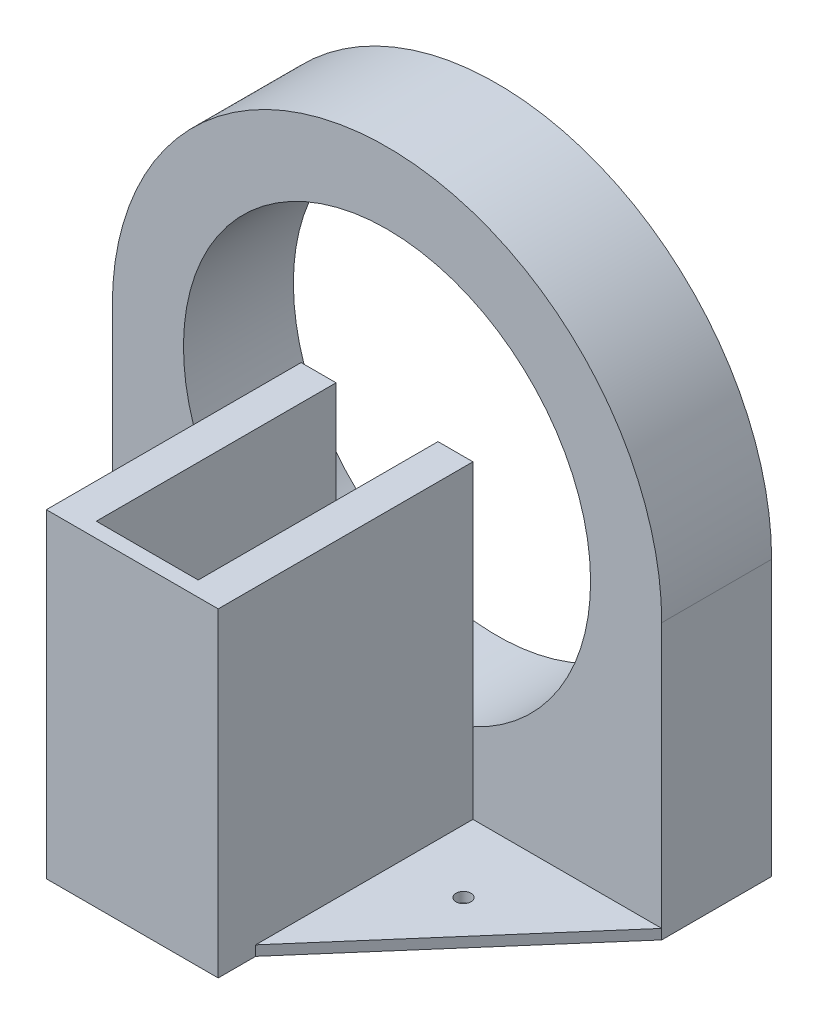
ISO-10303-21;
HEADER;
FILE_DESCRIPTION(('STEP AP214'),'2;1');
FILE_NAME('part.step','',(''),(''),'','','');
FILE_SCHEMA(('AUTOMOTIVE_DESIGN { 1 0 10303 214 1 1 1 1 }'));
ENDSEC;
DATA;
#1=APPLICATION_CONTEXT('core data for automotive mechanical design processes');
#2=APPLICATION_PROTOCOL_DEFINITION('international standard','automotive_design',2000,#1);
#3=PRODUCT_CONTEXT('',#1,'mechanical');
#4=PRODUCT('Part','Part','',(#3));
#5=PRODUCT_RELATED_PRODUCT_CATEGORY('part','',(#4));
#6=PRODUCT_DEFINITION_FORMATION('','',#4);
#7=PRODUCT_DEFINITION_CONTEXT('part definition',#1,'design');
#8=PRODUCT_DEFINITION('design','',#6,#7);
#9=PRODUCT_DEFINITION_SHAPE('','',#8);
#10=(LENGTH_UNIT() NAMED_UNIT(*) SI_UNIT(.MILLI.,.METRE.));
#11=(NAMED_UNIT(*) PLANE_ANGLE_UNIT() SI_UNIT($,.RADIAN.));
#12=(NAMED_UNIT(*) SI_UNIT($,.STERADIAN.) SOLID_ANGLE_UNIT());
#13=UNCERTAINTY_MEASURE_WITH_UNIT(LENGTH_MEASURE(1.E-05),#10,'distance_accuracy_value','');
#14=(GEOMETRIC_REPRESENTATION_CONTEXT(3) GLOBAL_UNCERTAINTY_ASSIGNED_CONTEXT((#13)) GLOBAL_UNIT_ASSIGNED_CONTEXT((#10,
#11,#12)) REPRESENTATION_CONTEXT('',''));
#15=CARTESIAN_POINT('',(0.,0.,0.));
#16=DIRECTION('',(0.,0.,1.));
#17=DIRECTION('',(1.,0.,0.));
#18=AXIS2_PLACEMENT_3D('',#15,#16,#17);
#19=CARTESIAN_POINT('',(10.2,0.,135.159204509821));
#20=DIRECTION('',(-1.,0.,0.));
#21=DIRECTION('',(0.,0.,1.));
#22=AXIS2_PLACEMENT_3D('',#19,#20,#21);
#23=PLANE('',#22);
#24=DIRECTION('',(0.,0.,-1.));
#25=VECTOR('',#24,1.);
#26=CARTESIAN_POINT('',(10.2,-31.2,135.159204509821));
#27=LINE('',#26,#25);
#28=CARTESIAN_POINT('',(10.2,-31.2,70.));
#29=VERTEX_POINT('',#28);
#30=CARTESIAN_POINT('',(10.2,-31.2,46.7));
#31=VERTEX_POINT('',#30);
#32=EDGE_CURVE('E288',#29,#31,#27,.T.);
#33=ORIENTED_EDGE('',*,*,#32,.F.);
#34=DIRECTION('',(0.,1.,0.));
#35=VECTOR('',#34,1.);
#36=CARTESIAN_POINT('',(10.2,-90.2080956599473,70.));
#37=LINE('',#36,#35);
#38=CARTESIAN_POINT('',(10.2,9.00000000000002,70.));
#39=VERTEX_POINT('',#38);
#40=EDGE_CURVE('E290',#29,#39,#37,.T.);
#41=ORIENTED_EDGE('',*,*,#40,.T.);
#42=DIRECTION('',(0.,0.,-1.));
#43=VECTOR('',#42,1.);
#44=CARTESIAN_POINT('',(10.2,9.00000000000002,135.159204509821));
#45=LINE('',#44,#43);
#46=CARTESIAN_POINT('',(10.2,9.00000000000002,22.));
#47=VERTEX_POINT('',#46);
#48=EDGE_CURVE('E296',#39,#47,#45,.T.);
#49=ORIENTED_EDGE('',*,*,#48,.T.);
#50=DIRECTION('',(0.,1.,0.));
#51=VECTOR('',#50,1.);
#52=CARTESIAN_POINT('',(10.2,0.,22.));
#53=LINE('',#52,#51);
#54=CARTESIAN_POINT('',(10.2,-31.2,22.));
#55=VERTEX_POINT('',#54);
#56=EDGE_CURVE('E452',#55,#47,#53,.T.);
#57=ORIENTED_EDGE('',*,*,#56,.F.);
#58=CARTESIAN_POINT('',(10.2,-31.2,37.7));
#59=VERTEX_POINT('',#58);
#60=EDGE_CURVE('E297',#59,#55,#27,.T.);
#61=ORIENTED_EDGE('',*,*,#60,.F.);
#62=DIRECTION('',(0.,1.,0.));
#63=VECTOR('',#62,1.);
#64=CARTESIAN_POINT('',(10.2,-37.7,37.7));
#65=LINE('',#64,#63);
#66=CARTESIAN_POINT('',(10.2,-37.7,37.7));
#67=VERTEX_POINT('',#66);
#68=EDGE_CURVE('E391',#67,#59,#65,.T.);
#69=ORIENTED_EDGE('',*,*,#68,.F.);
#70=DIRECTION('',(0.,0.,-1.));
#71=VECTOR('',#70,1.);
#72=CARTESIAN_POINT('',(10.2,-37.7,46.7));
#73=LINE('',#72,#71);
#74=CARTESIAN_POINT('',(10.2,-37.7,46.7));
#75=VERTEX_POINT('',#74);
#76=EDGE_CURVE('E371',#75,#67,#73,.T.);
#77=ORIENTED_EDGE('',*,*,#76,.F.);
#78=DIRECTION('',(0.,1.,0.));
#79=VECTOR('',#78,1.);
#80=CARTESIAN_POINT('',(10.2,-37.7,46.7));
#81=LINE('',#80,#79);
#82=EDGE_CURVE('E293',#75,#31,#81,.T.);
#83=ORIENTED_EDGE('',*,*,#82,.T.);
#84=EDGE_LOOP('',(#33,#41,#49,#57,#61,#69,#77,#83));
#85=FACE_BOUND('',#84,.T.);
#86=ADVANCED_FACE('F117',(#85),#23,.T.);
#87=CARTESIAN_POINT('',(-10.2,0.,135.159204509821));
#88=DIRECTION('',(-1.,0.,0.));
#89=DIRECTION('',(0.,0.,1.));
#90=AXIS2_PLACEMENT_3D('',#87,#88,#89);
#91=PLANE('',#90);
#92=DIRECTION('',(0.,1.,0.));
#93=VECTOR('',#92,1.);
#94=CARTESIAN_POINT('',(-10.2,-90.2080956599473,70.));
#95=LINE('',#94,#93);
#96=CARTESIAN_POINT('',(-10.2,-31.2,70.));
#97=VERTEX_POINT('',#96);
#98=CARTESIAN_POINT('',(-10.2,9.00000000000002,70.));
#99=VERTEX_POINT('',#98);
#100=EDGE_CURVE('E307',#97,#99,#95,.T.);
#101=ORIENTED_EDGE('',*,*,#100,.F.);
#102=DIRECTION('',(0.,0.,-1.));
#103=VECTOR('',#102,1.);
#104=CARTESIAN_POINT('',(-10.2,-31.2,135.159204509821));
#105=LINE('',#104,#103);
#106=CARTESIAN_POINT('',(-10.2,-31.2,46.7));
#107=VERTEX_POINT('',#106);
#108=EDGE_CURVE('E132',#97,#107,#105,.T.);
#109=ORIENTED_EDGE('',*,*,#108,.T.);
#110=DIRECTION('',(0.,1.,0.));
#111=VECTOR('',#110,1.);
#112=CARTESIAN_POINT('',(-10.2,-37.7,46.7));
#113=LINE('',#112,#111);
#114=CARTESIAN_POINT('',(-10.2,-37.7,46.7));
#115=VERTEX_POINT('',#114);
#116=EDGE_CURVE('E380',#115,#107,#113,.T.);
#117=ORIENTED_EDGE('',*,*,#116,.F.);
#118=DIRECTION('',(0.,0.,1.));
#119=VECTOR('',#118,1.);
#120=CARTESIAN_POINT('',(-10.2,-37.7,37.7));
#121=LINE('',#120,#119);
#122=CARTESIAN_POINT('',(-10.2,-37.7,37.7));
#123=VERTEX_POINT('',#122);
#124=EDGE_CURVE('E362',#123,#115,#121,.T.);
#125=ORIENTED_EDGE('',*,*,#124,.F.);
#126=DIRECTION('',(0.,1.,0.));
#127=VECTOR('',#126,1.);
#128=CARTESIAN_POINT('',(-10.2,-37.7,37.7));
#129=LINE('',#128,#127);
#130=CARTESIAN_POINT('',(-10.2,-31.2,37.7));
#131=VERTEX_POINT('',#130);
#132=EDGE_CURVE('E386',#123,#131,#129,.T.);
#133=ORIENTED_EDGE('',*,*,#132,.T.);
#134=CARTESIAN_POINT('',(-10.2,-31.2,22.));
#135=VERTEX_POINT('',#134);
#136=EDGE_CURVE('E467',#131,#135,#105,.T.);
#137=ORIENTED_EDGE('',*,*,#136,.T.);
#138=DIRECTION('',(0.,1.,0.));
#139=VECTOR('',#138,1.);
#140=CARTESIAN_POINT('',(-10.2,0.,22.));
#141=LINE('',#140,#139);
#142=CARTESIAN_POINT('',(-10.2,9.00000000000002,22.));
#143=VERTEX_POINT('',#142);
#144=EDGE_CURVE('E447',#135,#143,#141,.T.);
#145=ORIENTED_EDGE('',*,*,#144,.T.);
#146=DIRECTION('',(0.,0.,-1.));
#147=VECTOR('',#146,1.);
#148=CARTESIAN_POINT('',(-10.2,9.00000000000002,135.159204509821));
#149=LINE('',#148,#147);
#150=EDGE_CURVE('E456',#99,#143,#149,.T.);
#151=ORIENTED_EDGE('',*,*,#150,.F.);
#152=EDGE_LOOP('',(#101,#109,#117,#125,#133,#137,#145,#151));
#153=FACE_BOUND('',#152,.T.);
#154=ADVANCED_FACE('F531',(#153),#91,.F.);
#155=CARTESIAN_POINT('',(0.,-90.2080956599473,70.));
#156=DIRECTION('',(0.,0.,1.));
#157=DIRECTION('',(1.,0.,0.));
#158=AXIS2_PLACEMENT_3D('',#155,#156,#157);
#159=PLANE('',#158);
#160=DIRECTION('',(1.,0.,0.));
#161=VECTOR('',#160,1.);
#162=CARTESIAN_POINT('',(0.,-31.2,70.));
#163=LINE('',#162,#161);
#164=EDGE_CURVE('E302',#97,#29,#163,.T.);
#165=ORIENTED_EDGE('',*,*,#164,.F.);
#166=ORIENTED_EDGE('',*,*,#100,.T.);
#167=DIRECTION('',(1.,0.,0.));
#168=VECTOR('',#167,1.);
#169=CARTESIAN_POINT('',(0.,9.00000000000002,70.));
#170=LINE('',#169,#168);
#171=EDGE_CURVE('E305',#99,#39,#170,.T.);
#172=ORIENTED_EDGE('',*,*,#171,.T.);
#173=ORIENTED_EDGE('',*,*,#40,.F.);
#174=EDGE_LOOP('',(#165,#166,#172,#173));
#175=FACE_BOUND('',#174,.T.);
#176=ADVANCED_FACE('F301',(#175),#159,.F.);
#177=CARTESIAN_POINT('',(0.,9.00000000000002,65.5));
#178=DIRECTION('',(0.,-1.,0.));
#179=DIRECTION('',(0.,0.,-1.));
#180=AXIS2_PLACEMENT_3D('',#177,#178,#179);
#181=PLANE('',#180);
#182=ORIENTED_EDGE('',*,*,#48,.F.);
#183=ORIENTED_EDGE('',*,*,#171,.F.);
#184=ORIENTED_EDGE('',*,*,#150,.T.);
#185=DIRECTION('',(1.,0.,0.));
#186=VECTOR('',#185,1.);
#187=CARTESIAN_POINT('',(0.,9.00000000000002,22.));
#188=LINE('',#187,#186);
#189=CARTESIAN_POINT('',(-17.2,9.00000000000002,22.));
#190=VERTEX_POINT('',#189);
#191=EDGE_CURVE('E443',#190,#143,#188,.T.);
#192=ORIENTED_EDGE('',*,*,#191,.F.);
#193=DIRECTION('',(0.,0.,-1.));
#194=VECTOR('',#193,1.);
#195=CARTESIAN_POINT('',(-17.2,9.00000000000002,65.5));
#196=LINE('',#195,#194);
#197=CARTESIAN_POINT('',(-17.2,9.00000000000002,73.));
#198=VERTEX_POINT('',#197);
#199=EDGE_CURVE('E12',#198,#190,#196,.T.);
#200=ORIENTED_EDGE('',*,*,#199,.F.);
#201=DIRECTION('',(1.,0.,0.));
#202=VECTOR('',#201,1.);
#203=CARTESIAN_POINT('',(0.,9.00000000000002,73.));
#204=LINE('',#203,#202);
#205=CARTESIAN_POINT('',(17.2,9.00000000000002,73.));
#206=VERTEX_POINT('',#205);
#207=EDGE_CURVE('E311',#198,#206,#204,.T.);
#208=ORIENTED_EDGE('',*,*,#207,.T.);
#209=DIRECTION('',(0.,0.,-1.));
#210=VECTOR('',#209,1.);
#211=CARTESIAN_POINT('',(17.2,9.00000000000002,65.5));
#212=LINE('',#211,#210);
#213=CARTESIAN_POINT('',(17.2,9.00000000000002,22.));
#214=VERTEX_POINT('',#213);
#215=EDGE_CURVE('E125',#206,#214,#212,.T.);
#216=ORIENTED_EDGE('',*,*,#215,.T.);
#217=DIRECTION('',(-1.,0.,0.));
#218=VECTOR('',#217,1.);
#219=CARTESIAN_POINT('',(0.,9.00000000000002,22.));
#220=LINE('',#219,#218);
#221=EDGE_CURVE('E457',#214,#47,#220,.T.);
#222=ORIENTED_EDGE('',*,*,#221,.T.);
#223=EDGE_LOOP('',(#182,#183,#184,#192,#200,#208,#216,#222));
#224=FACE_BOUND('',#223,.T.);
#225=ADVANCED_FACE('F119',(#224),#181,.F.);
#226=CARTESIAN_POINT('',(-10.2,-37.7,37.7));
#227=DIRECTION('',(0.,0.,-1.));
#228=DIRECTION('',(-1.,0.,0.));
#229=AXIS2_PLACEMENT_3D('',#226,#227,#228);
#230=PLANE('',#229);
#231=DIRECTION('',(-1.,0.,0.));
#232=VECTOR('',#231,1.);
#233=CARTESIAN_POINT('',(-10.2,-37.7,37.7));
#234=LINE('',#233,#232);
#235=CARTESIAN_POINT('',(-3.5,-37.7,37.7));
#236=VERTEX_POINT('',#235);
#237=EDGE_CURVE('E375',#236,#123,#234,.T.);
#238=ORIENTED_EDGE('',*,*,#237,.F.);
#239=DIRECTION('',(0.,1.,0.));
#240=VECTOR('',#239,1.);
#241=CARTESIAN_POINT('',(-3.5,-47.5994949366117,37.7));
#242=LINE('',#241,#240);
#243=CARTESIAN_POINT('',(-3.5,-31.2,37.7));
#244=VERTEX_POINT('',#243);
#245=EDGE_CURVE('E143',#236,#244,#242,.T.);
#246=ORIENTED_EDGE('',*,*,#245,.T.);
#247=DIRECTION('',(-1.,0.,0.));
#248=VECTOR('',#247,1.);
#249=CARTESIAN_POINT('',(-10.2,-31.2,37.7));
#250=LINE('',#249,#248);
#251=EDGE_CURVE('E383',#244,#131,#250,.T.);
#252=ORIENTED_EDGE('',*,*,#251,.T.);
#253=ORIENTED_EDGE('',*,*,#132,.F.);
#254=EDGE_LOOP('',(#238,#246,#252,#253));
#255=FACE_BOUND('',#254,.T.);
#256=ADVANCED_FACE('F767',(#255),#230,.F.);
#257=CARTESIAN_POINT('',(0.,-31.2,135.159204509821));
#258=DIRECTION('',(0.,1.,0.));
#259=DIRECTION('',(0.,0.,1.));
#260=AXIS2_PLACEMENT_3D('',#257,#258,#259);
#261=PLANE('',#260);
#262=DIRECTION('',(0.,0.,1.));
#263=VECTOR('',#262,1.);
#264=CARTESIAN_POINT('',(-3.5,-31.2,37.7));
#265=LINE('',#264,#263);
#266=CARTESIAN_POINT('',(-3.5,-31.2,30.7));
#267=VERTEX_POINT('',#266);
#268=EDGE_CURVE('E325',#267,#244,#265,.T.);
#269=ORIENTED_EDGE('',*,*,#268,.F.);
#270=DIRECTION('',(-1.,0.,0.));
#271=VECTOR('',#270,1.);
#272=CARTESIAN_POINT('',(-3.5,-31.2,30.7));
#273=LINE('',#272,#271);
#274=CARTESIAN_POINT('',(3.5,-31.2,30.7));
#275=VERTEX_POINT('',#274);
#276=EDGE_CURVE('E351',#275,#267,#273,.T.);
#277=ORIENTED_EDGE('',*,*,#276,.F.);
#278=DIRECTION('',(0.,0.,-1.));
#279=VECTOR('',#278,1.);
#280=CARTESIAN_POINT('',(3.5,-31.2,37.7));
#281=LINE('',#280,#279);
#282=CARTESIAN_POINT('',(3.5,-31.2,37.7));
#283=VERTEX_POINT('',#282);
#284=EDGE_CURVE('E348',#283,#275,#281,.T.);
#285=ORIENTED_EDGE('',*,*,#284,.F.);
#286=EDGE_CURVE('E367',#59,#283,#250,.T.);
#287=ORIENTED_EDGE('',*,*,#286,.F.);
#288=ORIENTED_EDGE('',*,*,#60,.T.);
#289=DIRECTION('',(1.,0.,0.));
#290=VECTOR('',#289,1.);
#291=CARTESIAN_POINT('',(0.,-31.2,22.));
#292=LINE('',#291,#290);
#293=EDGE_CURVE('E446',#135,#55,#292,.T.);
#294=ORIENTED_EDGE('',*,*,#293,.F.);
#295=ORIENTED_EDGE('',*,*,#136,.F.);
#296=ORIENTED_EDGE('',*,*,#251,.F.);
#297=EDGE_LOOP('',(#269,#277,#285,#287,#288,#294,#295,#296));
#298=FACE_BOUND('',#297,.T.);
#299=ADVANCED_FACE('F601',(#298),#261,.T.);
#300=CARTESIAN_POINT('',(0.,0.,22.));
#301=DIRECTION('',(0.,0.,-1.));
#302=DIRECTION('',(-1.,0.,0.));
#303=AXIS2_PLACEMENT_3D('',#300,#301,#302);
#304=CYLINDRICAL_SURFACE('',#303,55.);
#305=CARTESIAN_POINT('',(0.,0.,22.));
#306=DIRECTION('',(0.,0.,1.));
#307=DIRECTION('',(1.,0.,0.));
#308=AXIS2_PLACEMENT_3D('',#305,#306,#307);
#309=CIRCLE('',#308,55.);
#310=CARTESIAN_POINT('',(55.,0.,22.));
#311=VERTEX_POINT('',#310);
#312=CARTESIAN_POINT('',(-55.,0.,22.));
#313=VERTEX_POINT('',#312);
#314=EDGE_CURVE('E505',#311,#313,#309,.T.);
#315=ORIENTED_EDGE('',*,*,#314,.F.);
#316=DIRECTION('',(0.,0.,1.));
#317=VECTOR('',#316,1.);
#318=CARTESIAN_POINT('',(55.,0.,-77.7817459305202));
#319=LINE('',#318,#317);
#320=CARTESIAN_POINT('',(55.,0.,0.));
#321=VERTEX_POINT('',#320);
#322=EDGE_CURVE('E476',#321,#311,#319,.T.);
#323=ORIENTED_EDGE('',*,*,#322,.F.);
#324=CARTESIAN_POINT('',(0.,0.,0.));
#325=DIRECTION('',(0.,0.,1.));
#326=DIRECTION('',(1.,0.,0.));
#327=AXIS2_PLACEMENT_3D('',#324,#325,#326);
#328=CIRCLE('',#327,55.);
#329=CARTESIAN_POINT('',(-55.,0.,0.));
#330=VERTEX_POINT('',#329);
#331=EDGE_CURVE('E500',#321,#330,#328,.T.);
#332=ORIENTED_EDGE('',*,*,#331,.T.);
#333=DIRECTION('',(0.,0.,1.));
#334=VECTOR('',#333,1.);
#335=CARTESIAN_POINT('',(-55.,0.,-77.7817459305202));
#336=LINE('',#335,#334);
#337=EDGE_CURVE('E486',#330,#313,#336,.T.);
#338=ORIENTED_EDGE('',*,*,#337,.T.);
#339=EDGE_LOOP('',(#315,#323,#332,#338));
#340=FACE_BOUND('',#339,.T.);
#341=ADVANCED_FACE('F580',(#340),#304,.T.);
#342=CARTESIAN_POINT('',(0.,0.,22.));
#343=DIRECTION('',(0.,0.,-1.));
#344=DIRECTION('',(-1.,0.,0.));
#345=AXIS2_PLACEMENT_3D('',#342,#343,#344);
#346=CYLINDRICAL_SURFACE('',#345,40.75);
#347=CARTESIAN_POINT('',(0.,0.,22.));
#348=DIRECTION('',(0.,0.,1.));
#349=DIRECTION('',(1.,0.,0.));
#350=AXIS2_PLACEMENT_3D('',#347,#348,#349);
#351=CIRCLE('',#350,40.75);
#352=CARTESIAN_POINT('',(-17.2,-36.9421507224471,22.));
#353=VERTEX_POINT('',#352);
#354=CARTESIAN_POINT('',(17.2,-36.9421507224471,22.));
#355=VERTEX_POINT('',#354);
#356=EDGE_CURVE('E496',#353,#355,#351,.T.);
#357=ORIENTED_EDGE('',*,*,#356,.T.);
#358=EDGE_CURVE('E501',#355,#353,#351,.T.);
#359=ORIENTED_EDGE('',*,*,#358,.T.);
#360=EDGE_LOOP('',(#357,#359));
#361=FACE_BOUND('',#360,.T.);
#362=CARTESIAN_POINT('',(0.,0.,0.));
#363=DIRECTION('',(0.,0.,1.));
#364=DIRECTION('',(1.,0.,0.));
#365=AXIS2_PLACEMENT_3D('',#362,#363,#364);
#366=CIRCLE('',#365,40.75);
#367=CARTESIAN_POINT('',(40.75,0.,0.));
#368=VERTEX_POINT('',#367);
#369=EDGE_CURVE('E495',#368,#368,#366,.T.);
#370=ORIENTED_EDGE('',*,*,#369,.F.);
#371=EDGE_LOOP('',(#370));
#372=FACE_BOUND('',#371,.T.);
#373=ADVANCED_FACE('F544',(#361,#372),#346,.F.);
#374=CARTESIAN_POINT('',(0.,-53.,0.));
#375=DIRECTION('',(0.,-1.,0.));
#376=DIRECTION('',(0.,0.,-1.));
#377=AXIS2_PLACEMENT_3D('',#374,#375,#376);
#378=PLANE('',#377);
#379=CARTESIAN_POINT('',(29.8,-53.,36.5));
#380=DIRECTION('',(0.,-1.,0.));
#381=DIRECTION('',(0.,0.,-1.));
#382=AXIS2_PLACEMENT_3D('',#379,#380,#381);
#383=CIRCLE('',#382,1.5);
#384=CARTESIAN_POINT('',(29.8,-53.,35.));
#385=VERTEX_POINT('',#384);
#386=EDGE_CURVE('E401',#385,#385,#383,.T.);
#387=ORIENTED_EDGE('',*,*,#386,.T.);
#388=EDGE_LOOP('',(#387));
#389=FACE_BOUND('',#388,.T.);
#390=DIRECTION('',(0.,0.,-1.));
#391=VECTOR('',#390,1.);
#392=CARTESIAN_POINT('',(17.2,-53.,65.5));
#393=LINE('',#392,#391);
#394=CARTESIAN_POINT('',(17.2,-53.,65.5));
#395=VERTEX_POINT('',#394);
#396=CARTESIAN_POINT('',(17.2,-53.,22.));
#397=VERTEX_POINT('',#396);
#398=EDGE_CURVE('E402',#395,#397,#393,.T.);
#399=ORIENTED_EDGE('',*,*,#398,.F.);
#400=DIRECTION('',(-0.655920912175122,0.,0.75482962115391));
#401=VECTOR('',#400,1.);
#402=CARTESIAN_POINT('',(17.2,-53.,65.5));
#403=LINE('',#402,#401);
#404=CARTESIAN_POINT('',(55.,-53.,22.));
#405=VERTEX_POINT('',#404);
#406=EDGE_CURVE('E390',#405,#395,#403,.T.);
#407=ORIENTED_EDGE('',*,*,#406,.F.);
#408=DIRECTION('',(1.,0.,0.));
#409=VECTOR('',#408,1.);
#410=CARTESIAN_POINT('',(17.2,-53.,22.));
#411=LINE('',#410,#409);
#412=EDGE_CURVE('E406',#397,#405,#411,.T.);
#413=ORIENTED_EDGE('',*,*,#412,.F.);
#414=EDGE_LOOP('',(#399,#407,#413));
#415=FACE_BOUND('',#414,.T.);
#416=ADVANCED_FACE('F575',(#389,#415),#378,.F.);
#417=CARTESIAN_POINT('',(29.8,-53.,36.5));
#418=DIRECTION('',(0.,-1.,0.));
#419=DIRECTION('',(0.,0.,-1.));
#420=AXIS2_PLACEMENT_3D('',#417,#418,#419);
#421=CYLINDRICAL_SURFACE('',#420,1.5);
#422=ORIENTED_EDGE('',*,*,#386,.F.);
#423=EDGE_LOOP('',(#422));
#424=FACE_BOUND('',#423,.T.);
#425=CARTESIAN_POINT('',(29.8,-55.,36.5));
#426=DIRECTION('',(0.,-1.,0.));
#427=DIRECTION('',(0.,0.,-1.));
#428=AXIS2_PLACEMENT_3D('',#425,#426,#427);
#429=CIRCLE('',#428,1.5);
#430=CARTESIAN_POINT('',(29.8,-55.,35.));
#431=VERTEX_POINT('',#430);
#432=EDGE_CURVE('E411',#431,#431,#429,.T.);
#433=ORIENTED_EDGE('',*,*,#432,.T.);
#434=EDGE_LOOP('',(#433));
#435=FACE_BOUND('',#434,.T.);
#436=ADVANCED_FACE('F597',(#424,#435),#421,.F.);
#437=CARTESIAN_POINT('',(-29.8,-53.,36.5));
#438=DIRECTION('',(0.,-1.,0.));
#439=DIRECTION('',(0.,0.,-1.));
#440=AXIS2_PLACEMENT_3D('',#437,#438,#439);
#441=CYLINDRICAL_SURFACE('',#440,1.5);
#442=CARTESIAN_POINT('',(-29.8,-53.,36.5));
#443=DIRECTION('',(0.,-1.,0.));
#444=DIRECTION('',(0.,0.,-1.));
#445=AXIS2_PLACEMENT_3D('',#442,#443,#444);
#446=CIRCLE('',#445,1.5);
#447=CARTESIAN_POINT('',(-29.8,-53.,35.));
#448=VERTEX_POINT('',#447);
#449=EDGE_CURVE('E417',#448,#448,#446,.T.);
#450=ORIENTED_EDGE('',*,*,#449,.F.);
#451=EDGE_LOOP('',(#450));
#452=FACE_BOUND('',#451,.T.);
#453=CARTESIAN_POINT('',(-29.8,-55.,36.5));
#454=DIRECTION('',(0.,-1.,0.));
#455=DIRECTION('',(0.,0.,-1.));
#456=AXIS2_PLACEMENT_3D('',#453,#454,#455);
#457=CIRCLE('',#456,1.5);
#458=CARTESIAN_POINT('',(-29.8,-55.,35.));
#459=VERTEX_POINT('',#458);
#460=EDGE_CURVE('E414',#459,#459,#457,.T.);
#461=ORIENTED_EDGE('',*,*,#460,.T.);
#462=EDGE_LOOP('',(#461));
#463=FACE_BOUND('',#462,.T.);
#464=ADVANCED_FACE('F618',(#452,#463),#441,.F.);
#465=CARTESIAN_POINT('',(55.,0.,-77.7817459305202));
#466=DIRECTION('',(1.,0.,0.));
#467=DIRECTION('',(0.,0.,-1.));
#468=AXIS2_PLACEMENT_3D('',#465,#466,#467);
#469=PLANE('',#468);
#470=DIRECTION('',(0.,-1.,0.));
#471=VECTOR('',#470,1.);
#472=CARTESIAN_POINT('',(55.,0.,0.));
#473=LINE('',#472,#471);
#474=CARTESIAN_POINT('',(55.,-55.,0.));
#475=VERTEX_POINT('',#474);
#476=EDGE_CURVE('E470',#321,#475,#473,.T.);
#477=ORIENTED_EDGE('',*,*,#476,.F.);
#478=ORIENTED_EDGE('',*,*,#322,.T.);
#479=DIRECTION('',(0.,1.,0.));
#480=VECTOR('',#479,1.);
#481=CARTESIAN_POINT('',(55.,0.,22.));
#482=LINE('',#481,#480);
#483=EDGE_CURVE('E479',#405,#311,#482,.T.);
#484=ORIENTED_EDGE('',*,*,#483,.F.);
#485=CARTESIAN_POINT('',(55.,-55.,22.));
#486=VERTEX_POINT('',#485);
#487=EDGE_CURVE('E474',#486,#405,#482,.T.);
#488=ORIENTED_EDGE('',*,*,#487,.F.);
#489=DIRECTION('',(0.,0.,1.));
#490=VECTOR('',#489,1.);
#491=CARTESIAN_POINT('',(55.,-55.,-77.7817459305202));
#492=LINE('',#491,#490);
#493=EDGE_CURVE('E463',#475,#486,#492,.T.);
#494=ORIENTED_EDGE('',*,*,#493,.F.);
#495=EDGE_LOOP('',(#477,#478,#484,#488,#494));
#496=FACE_BOUND('',#495,.T.);
#497=ADVANCED_FACE('F573',(#496),#469,.T.);
#498=CARTESIAN_POINT('',(0.,0.,0.));
#499=DIRECTION('',(0.,0.,1.));
#500=DIRECTION('',(1.,0.,0.));
#501=AXIS2_PLACEMENT_3D('',#498,#499,#500);
#502=PLANE('',#501);
#503=ORIENTED_EDGE('',*,*,#331,.F.);
#504=ORIENTED_EDGE('',*,*,#476,.T.);
#505=DIRECTION('',(-1.,0.,0.));
#506=VECTOR('',#505,1.);
#507=CARTESIAN_POINT('',(0.,-55.,0.));
#508=LINE('',#507,#506);
#509=CARTESIAN_POINT('',(-55.,-55.,0.));
#510=VERTEX_POINT('',#509);
#511=EDGE_CURVE('E485',#475,#510,#508,.T.);
#512=ORIENTED_EDGE('',*,*,#511,.T.);
#513=DIRECTION('',(0.,1.,0.));
#514=VECTOR('',#513,1.);
#515=CARTESIAN_POINT('',(-55.,0.,0.));
#516=LINE('',#515,#514);
#517=EDGE_CURVE('E482',#510,#330,#516,.T.);
#518=ORIENTED_EDGE('',*,*,#517,.T.);
#519=EDGE_LOOP('',(#503,#504,#512,#518));
#520=FACE_BOUND('',#519,.T.);
#521=ORIENTED_EDGE('',*,*,#369,.T.);
#522=EDGE_LOOP('',(#521));
#523=FACE_BOUND('',#522,.T.);
#524=ADVANCED_FACE('F587',(#520,#523),#502,.F.);
#525=CARTESIAN_POINT('',(-55.,0.,-77.7817459305202));
#526=DIRECTION('',(-1.,0.,0.));
#527=DIRECTION('',(0.,-1.,0.));
#528=AXIS2_PLACEMENT_3D('',#525,#526,#527);
#529=PLANE('',#528);
#530=ORIENTED_EDGE('',*,*,#517,.F.);
#531=DIRECTION('',(0.,0.,1.));
#532=VECTOR('',#531,1.);
#533=CARTESIAN_POINT('',(-55.,-55.,-77.7817459305202));
#534=LINE('',#533,#532);
#535=CARTESIAN_POINT('',(-55.,-55.,22.));
#536=VERTEX_POINT('',#535);
#537=EDGE_CURVE('E489',#510,#536,#534,.T.);
#538=ORIENTED_EDGE('',*,*,#537,.T.);
#539=DIRECTION('',(0.,-1.,0.));
#540=VECTOR('',#539,1.);
#541=CARTESIAN_POINT('',(-55.,-53.,22.));
#542=LINE('',#541,#540);
#543=CARTESIAN_POINT('',(-55.,-53.,22.));
#544=VERTEX_POINT('',#543);
#545=EDGE_CURVE('E434',#544,#536,#542,.T.);
#546=ORIENTED_EDGE('',*,*,#545,.F.);
#547=DIRECTION('',(0.,-1.,0.));
#548=VECTOR('',#547,1.);
#549=CARTESIAN_POINT('',(-55.,0.,22.));
#550=LINE('',#549,#548);
#551=EDGE_CURVE('E473',#313,#544,#550,.T.);
#552=ORIENTED_EDGE('',*,*,#551,.F.);
#553=ORIENTED_EDGE('',*,*,#337,.F.);
#554=EDGE_LOOP('',(#530,#538,#546,#552,#553));
#555=FACE_BOUND('',#554,.T.);
#556=ADVANCED_FACE('F585',(#555),#529,.T.);
#557=CARTESIAN_POINT('',(0.,-53.,0.));
#558=DIRECTION('',(0.,1.,0.));
#559=DIRECTION('',(0.,0.,1.));
#560=AXIS2_PLACEMENT_3D('',#557,#558,#559);
#561=PLANE('',#560);
#562=ORIENTED_EDGE('',*,*,#449,.T.);
#563=EDGE_LOOP('',(#562));
#564=FACE_BOUND('',#563,.T.);
#565=DIRECTION('',(0.,0.,1.));
#566=VECTOR('',#565,1.);
#567=CARTESIAN_POINT('',(-17.2,-53.,65.5));
#568=LINE('',#567,#566);
#569=CARTESIAN_POINT('',(-17.2,-53.,22.));
#570=VERTEX_POINT('',#569);
#571=CARTESIAN_POINT('',(-17.2,-53.,65.5));
#572=VERTEX_POINT('',#571);
#573=EDGE_CURVE('E423',#570,#572,#568,.T.);
#574=ORIENTED_EDGE('',*,*,#573,.F.);
#575=DIRECTION('',(1.,0.,0.));
#576=VECTOR('',#575,1.);
#577=CARTESIAN_POINT('',(-17.2,-53.,22.));
#578=LINE('',#577,#576);
#579=EDGE_CURVE('E429',#544,#570,#578,.T.);
#580=ORIENTED_EDGE('',*,*,#579,.F.);
#581=DIRECTION('',(-0.655920912175122,0.,-0.75482962115391));
#582=VECTOR('',#581,1.);
#583=CARTESIAN_POINT('',(-55.,-53.,22.));
#584=LINE('',#583,#582);
#585=EDGE_CURVE('E426',#572,#544,#584,.T.);
#586=ORIENTED_EDGE('',*,*,#585,.F.);
#587=EDGE_LOOP('',(#574,#580,#586));
#588=FACE_BOUND('',#587,.T.);
#589=ADVANCED_FACE('F555',(#564,#588),#561,.T.);
#590=CARTESIAN_POINT('',(0.,0.,22.));
#591=DIRECTION('',(0.,0.,1.));
#592=DIRECTION('',(1.,0.,0.));
#593=AXIS2_PLACEMENT_3D('',#590,#591,#592);
#594=PLANE('',#593);
#595=DIRECTION('',(0.,1.,0.));
#596=VECTOR('',#595,1.);
#597=CARTESIAN_POINT('',(17.2,0.,22.));
#598=LINE('',#597,#596);
#599=EDGE_CURVE('E461',#397,#355,#598,.T.);
#600=ORIENTED_EDGE('',*,*,#599,.F.);
#601=ORIENTED_EDGE('',*,*,#412,.T.);
#602=ORIENTED_EDGE('',*,*,#483,.T.);
#603=ORIENTED_EDGE('',*,*,#314,.T.);
#604=ORIENTED_EDGE('',*,*,#551,.T.);
#605=ORIENTED_EDGE('',*,*,#579,.T.);
#606=DIRECTION('',(0.,1.,0.));
#607=VECTOR('',#606,1.);
#608=CARTESIAN_POINT('',(-17.2,0.,22.));
#609=LINE('',#608,#607);
#610=EDGE_CURVE('E440',#570,#353,#609,.T.);
#611=ORIENTED_EDGE('',*,*,#610,.T.);
#612=ORIENTED_EDGE('',*,*,#358,.F.);
#613=EDGE_LOOP('',(#600,#601,#602,#603,#604,#605,#611,#612));
#614=FACE_BOUND('',#613,.T.);
#615=ADVANCED_FACE('F547',(#614),#594,.T.);
#616=CARTESIAN_POINT('',(0.,0.,22.));
#617=DIRECTION('',(0.,0.,1.));
#618=DIRECTION('',(1.,0.,0.));
#619=AXIS2_PLACEMENT_3D('',#616,#617,#618);
#620=PLANE('',#619);
#621=ORIENTED_EDGE('',*,*,#356,.F.);
#622=EDGE_CURVE('E437',#353,#190,#609,.T.);
#623=ORIENTED_EDGE('',*,*,#622,.T.);
#624=ORIENTED_EDGE('',*,*,#191,.T.);
#625=ORIENTED_EDGE('',*,*,#144,.F.);
#626=ORIENTED_EDGE('',*,*,#293,.T.);
#627=ORIENTED_EDGE('',*,*,#56,.T.);
#628=ORIENTED_EDGE('',*,*,#221,.F.);
#629=EDGE_CURVE('E460',#355,#214,#598,.T.);
#630=ORIENTED_EDGE('',*,*,#629,.F.);
#631=EDGE_LOOP('',(#621,#623,#624,#625,#626,#627,#628,#630));
#632=FACE_BOUND('',#631,.T.);
#633=ADVANCED_FACE('F523',(#632),#620,.F.);
#634=CARTESIAN_POINT('',(17.2,0.,65.5));
#635=DIRECTION('',(-1.,0.,0.));
#636=DIRECTION('',(0.,-1.,0.));
#637=AXIS2_PLACEMENT_3D('',#634,#635,#636);
#638=PLANE('',#637);
#639=ORIENTED_EDGE('',*,*,#398,.T.);
#640=ORIENTED_EDGE('',*,*,#599,.T.);
#641=ORIENTED_EDGE('',*,*,#629,.T.);
#642=ORIENTED_EDGE('',*,*,#215,.F.);
#643=DIRECTION('',(0.,1.,0.));
#644=VECTOR('',#643,1.);
#645=CARTESIAN_POINT('',(17.2,-90.2080956599473,73.));
#646=LINE('',#645,#644);
#647=CARTESIAN_POINT('',(17.2,-55.,73.));
#648=VERTEX_POINT('',#647);
#649=EDGE_CURVE('E308',#648,#206,#646,.T.);
#650=ORIENTED_EDGE('',*,*,#649,.F.);
#651=DIRECTION('',(0.,0.,-1.));
#652=VECTOR('',#651,1.);
#653=CARTESIAN_POINT('',(17.2,-55.,0.));
#654=LINE('',#653,#652);
#655=CARTESIAN_POINT('',(17.2,-55.,65.5));
#656=VERTEX_POINT('',#655);
#657=EDGE_CURVE('E322',#648,#656,#654,.T.);
#658=ORIENTED_EDGE('',*,*,#657,.T.);
#659=DIRECTION('',(0.,1.,0.));
#660=VECTOR('',#659,1.);
#661=CARTESIAN_POINT('',(17.2,0.,65.5));
#662=LINE('',#661,#660);
#663=EDGE_CURVE('E507',#656,#395,#662,.T.);
#664=ORIENTED_EDGE('',*,*,#663,.T.);
#665=EDGE_LOOP('',(#639,#640,#641,#642,#650,#658,#664));
#666=FACE_BOUND('',#665,.T.);
#667=ADVANCED_FACE('F519',(#666),#638,.F.);
#668=CARTESIAN_POINT('',(17.2,-53.,65.5));
#669=DIRECTION('',(0.75482962115391,0.,0.655920912175122));
#670=DIRECTION('',(0.655920912175122,0.,-0.75482962115391));
#671=AXIS2_PLACEMENT_3D('',#668,#669,#670);
#672=PLANE('',#671);
#673=DIRECTION('',(-0.655920912175122,0.,0.75482962115391));
#674=VECTOR('',#673,1.);
#675=CARTESIAN_POINT('',(17.2,-55.,65.5));
#676=LINE('',#675,#674);
#677=EDGE_CURVE('E397',#486,#656,#676,.T.);
#678=ORIENTED_EDGE('',*,*,#677,.F.);
#679=ORIENTED_EDGE('',*,*,#487,.T.);
#680=ORIENTED_EDGE('',*,*,#406,.T.);
#681=ORIENTED_EDGE('',*,*,#663,.F.);
#682=EDGE_LOOP('',(#678,#679,#680,#681));
#683=FACE_BOUND('',#682,.T.);
#684=ADVANCED_FACE('F568',(#683),#672,.T.);
#685=CARTESIAN_POINT('',(0.,-55.,65.5));
#686=DIRECTION('',(0.,1.,0.));
#687=DIRECTION('',(0.,0.,1.));
#688=AXIS2_PLACEMENT_3D('',#685,#686,#687);
#689=PLANE('',#688);
#690=ORIENTED_EDGE('',*,*,#432,.F.);
#691=EDGE_LOOP('',(#690));
#692=FACE_BOUND('',#691,.T.);
#693=ORIENTED_EDGE('',*,*,#460,.F.);
#694=EDGE_LOOP('',(#693));
#695=FACE_BOUND('',#694,.T.);
#696=ORIENTED_EDGE('',*,*,#677,.T.);
#697=ORIENTED_EDGE('',*,*,#657,.F.);
#698=DIRECTION('',(-1.,0.,0.));
#699=VECTOR('',#698,1.);
#700=CARTESIAN_POINT('',(0.,-55.,73.));
#701=LINE('',#700,#699);
#702=CARTESIAN_POINT('',(-17.2,-55.,73.));
#703=VERTEX_POINT('',#702);
#704=EDGE_CURVE('E320',#648,#703,#701,.T.);
#705=ORIENTED_EDGE('',*,*,#704,.T.);
#706=DIRECTION('',(0.,0.,-1.));
#707=VECTOR('',#706,1.);
#708=CARTESIAN_POINT('',(-17.1999999999999,-55.,0.));
#709=LINE('',#708,#707);
#710=CARTESIAN_POINT('',(-17.2,-55.,65.5));
#711=VERTEX_POINT('',#710);
#712=EDGE_CURVE('E317',#703,#711,#709,.T.);
#713=ORIENTED_EDGE('',*,*,#712,.T.);
#714=DIRECTION('',(-0.655920912175122,0.,-0.75482962115391));
#715=VECTOR('',#714,1.);
#716=CARTESIAN_POINT('',(-55.,-55.,22.));
#717=LINE('',#716,#715);
#718=EDGE_CURVE('E420',#711,#536,#717,.T.);
#719=ORIENTED_EDGE('',*,*,#718,.T.);
#720=ORIENTED_EDGE('',*,*,#537,.F.);
#721=ORIENTED_EDGE('',*,*,#511,.F.);
#722=ORIENTED_EDGE('',*,*,#493,.T.);
#723=EDGE_LOOP('',(#696,#697,#705,#713,#719,#720,#721,#722));
#724=FACE_BOUND('',#723,.T.);
#725=ADVANCED_FACE('F561',(#692,#695,#724),#689,.F.);
#726=CARTESIAN_POINT('',(-55.,-53.,22.));
#727=DIRECTION('',(-0.75482962115391,0.,0.655920912175122));
#728=DIRECTION('',(0.655920912175122,0.,0.75482962115391));
#729=AXIS2_PLACEMENT_3D('',#726,#727,#728);
#730=PLANE('',#729);
#731=ORIENTED_EDGE('',*,*,#718,.F.);
#732=DIRECTION('',(0.,-1.,0.));
#733=VECTOR('',#732,1.);
#734=CARTESIAN_POINT('',(-17.2,-53.,65.5));
#735=LINE('',#734,#733);
#736=EDGE_CURVE('E431',#572,#711,#735,.T.);
#737=ORIENTED_EDGE('',*,*,#736,.F.);
#738=ORIENTED_EDGE('',*,*,#585,.T.);
#739=ORIENTED_EDGE('',*,*,#545,.T.);
#740=EDGE_LOOP('',(#731,#737,#738,#739));
#741=FACE_BOUND('',#740,.T.);
#742=ADVANCED_FACE('F557',(#741),#730,.T.);
#743=CARTESIAN_POINT('',(-17.2,0.,65.5));
#744=DIRECTION('',(1.,0.,0.));
#745=DIRECTION('',(0.,0.,-1.));
#746=AXIS2_PLACEMENT_3D('',#743,#744,#745);
#747=PLANE('',#746);
#748=ORIENTED_EDGE('',*,*,#610,.F.);
#749=ORIENTED_EDGE('',*,*,#573,.T.);
#750=ORIENTED_EDGE('',*,*,#736,.T.);
#751=ORIENTED_EDGE('',*,*,#712,.F.);
#752=DIRECTION('',(0.,1.,0.));
#753=VECTOR('',#752,1.);
#754=CARTESIAN_POINT('',(-17.2,-90.2080956599473,73.));
#755=LINE('',#754,#753);
#756=EDGE_CURVE('E329',#703,#198,#755,.T.);
#757=ORIENTED_EDGE('',*,*,#756,.T.);
#758=ORIENTED_EDGE('',*,*,#199,.T.);
#759=ORIENTED_EDGE('',*,*,#622,.F.);
#760=EDGE_LOOP('',(#748,#749,#750,#751,#757,#758,#759));
#761=FACE_BOUND('',#760,.T.);
#762=ADVANCED_FACE('F551',(#761),#747,.F.);
#763=DIRECTION('',(1.,0.,0.));
#764=VECTOR('',#763,1.);
#765=CARTESIAN_POINT('',(-10.2,-31.2,46.7));
#766=LINE('',#765,#764);
#767=EDGE_CURVE('E345',#107,#31,#766,.T.);
#768=ORIENTED_EDGE('',*,*,#767,.F.);
#769=ORIENTED_EDGE('',*,*,#108,.F.);
#770=ORIENTED_EDGE('',*,*,#164,.T.);
#771=ORIENTED_EDGE('',*,*,#32,.T.);
#772=EDGE_LOOP('',(#768,#769,#770,#771));
#773=FACE_BOUND('',#772,.T.);
#774=ADVANCED_FACE('F310',(#773),#261,.T.);
#775=ORIENTED_EDGE('',*,*,#286,.T.);
#776=DIRECTION('',(0.,1.,0.));
#777=VECTOR('',#776,1.);
#778=CARTESIAN_POINT('',(3.5,-47.5994949366117,37.7));
#779=LINE('',#778,#777);
#780=CARTESIAN_POINT('',(3.5,-37.7,37.7));
#781=VERTEX_POINT('',#780);
#782=EDGE_CURVE('E357',#781,#283,#779,.T.);
#783=ORIENTED_EDGE('',*,*,#782,.F.);
#784=EDGE_CURVE('E376',#67,#781,#234,.T.);
#785=ORIENTED_EDGE('',*,*,#784,.F.);
#786=ORIENTED_EDGE('',*,*,#68,.T.);
#787=EDGE_LOOP('',(#775,#783,#785,#786));
#788=FACE_BOUND('',#787,.T.);
#789=ADVANCED_FACE('F615',(#788),#230,.F.);
#790=CARTESIAN_POINT('',(-10.2,-37.7,46.7));
#791=DIRECTION('',(0.,0.,1.));
#792=DIRECTION('',(1.,0.,0.));
#793=AXIS2_PLACEMENT_3D('',#790,#791,#792);
#794=PLANE('',#793);
#795=ORIENTED_EDGE('',*,*,#767,.T.);
#796=ORIENTED_EDGE('',*,*,#82,.F.);
#797=DIRECTION('',(1.,0.,0.));
#798=VECTOR('',#797,1.);
#799=CARTESIAN_POINT('',(-10.2,-37.7,46.7));
#800=LINE('',#799,#798);
#801=EDGE_CURVE('E366',#115,#75,#800,.T.);
#802=ORIENTED_EDGE('',*,*,#801,.F.);
#803=ORIENTED_EDGE('',*,*,#116,.T.);
#804=EDGE_LOOP('',(#795,#796,#802,#803));
#805=FACE_BOUND('',#804,.T.);
#806=ADVANCED_FACE('F819',(#805),#794,.F.);
#807=CARTESIAN_POINT('',(0.,-37.7,0.));
#808=DIRECTION('',(0.,1.,0.));
#809=DIRECTION('',(0.,0.,1.));
#810=AXIS2_PLACEMENT_3D('',#807,#808,#809);
#811=PLANE('',#810);
#812=ORIENTED_EDGE('',*,*,#124,.T.);
#813=ORIENTED_EDGE('',*,*,#801,.T.);
#814=ORIENTED_EDGE('',*,*,#76,.T.);
#815=ORIENTED_EDGE('',*,*,#784,.T.);
#816=DIRECTION('',(0.,0.,1.));
#817=VECTOR('',#816,1.);
#818=CARTESIAN_POINT('',(3.5,-37.7,37.7));
#819=LINE('',#818,#817);
#820=CARTESIAN_POINT('',(3.5,-37.7,30.7));
#821=VERTEX_POINT('',#820);
#822=EDGE_CURVE('E336',#821,#781,#819,.T.);
#823=ORIENTED_EDGE('',*,*,#822,.F.);
#824=DIRECTION('',(1.,0.,0.));
#825=VECTOR('',#824,1.);
#826=CARTESIAN_POINT('',(-3.5,-37.7,30.7));
#827=LINE('',#826,#825);
#828=CARTESIAN_POINT('',(-3.5,-37.7,30.7));
#829=VERTEX_POINT('',#828);
#830=EDGE_CURVE('E339',#829,#821,#827,.T.);
#831=ORIENTED_EDGE('',*,*,#830,.F.);
#832=DIRECTION('',(0.,0.,-1.));
#833=VECTOR('',#832,1.);
#834=CARTESIAN_POINT('',(-3.5,-37.7,37.7));
#835=LINE('',#834,#833);
#836=EDGE_CURVE('E342',#236,#829,#835,.T.);
#837=ORIENTED_EDGE('',*,*,#836,.F.);
#838=ORIENTED_EDGE('',*,*,#237,.T.);
#839=EDGE_LOOP('',(#812,#813,#814,#815,#823,#831,#837,#838));
#840=FACE_BOUND('',#839,.T.);
#841=ADVANCED_FACE('F798',(#840),#811,.T.);
#842=CARTESIAN_POINT('',(-3.5,-47.5994949366117,37.7));
#843=DIRECTION('',(-1.,0.,0.));
#844=DIRECTION('',(0.,0.,1.));
#845=AXIS2_PLACEMENT_3D('',#842,#843,#844);
#846=PLANE('',#845);
#847=ORIENTED_EDGE('',*,*,#836,.T.);
#848=DIRECTION('',(0.,1.,0.));
#849=VECTOR('',#848,1.);
#850=CARTESIAN_POINT('',(-3.5,-47.5994949366117,30.7));
#851=LINE('',#850,#849);
#852=EDGE_CURVE('E340',#829,#267,#851,.T.);
#853=ORIENTED_EDGE('',*,*,#852,.T.);
#854=ORIENTED_EDGE('',*,*,#268,.T.);
#855=ORIENTED_EDGE('',*,*,#245,.F.);
#856=EDGE_LOOP('',(#847,#853,#854,#855));
#857=FACE_BOUND('',#856,.T.);
#858=ADVANCED_FACE('F789',(#857),#846,.F.);
#859=CARTESIAN_POINT('',(-3.5,-47.5994949366117,30.7));
#860=DIRECTION('',(0.,0.,-1.));
#861=DIRECTION('',(-1.,0.,0.));
#862=AXIS2_PLACEMENT_3D('',#859,#860,#861);
#863=PLANE('',#862);
#864=ORIENTED_EDGE('',*,*,#830,.T.);
#865=DIRECTION('',(0.,1.,0.));
#866=VECTOR('',#865,1.);
#867=CARTESIAN_POINT('',(3.5,-47.5994949366117,30.7));
#868=LINE('',#867,#866);
#869=EDGE_CURVE('E355',#821,#275,#868,.T.);
#870=ORIENTED_EDGE('',*,*,#869,.T.);
#871=ORIENTED_EDGE('',*,*,#276,.T.);
#872=ORIENTED_EDGE('',*,*,#852,.F.);
#873=EDGE_LOOP('',(#864,#870,#871,#872));
#874=FACE_BOUND('',#873,.T.);
#875=ADVANCED_FACE('F780',(#874),#863,.F.);
#876=CARTESIAN_POINT('',(3.5,-47.5994949366117,37.7));
#877=DIRECTION('',(1.,0.,0.));
#878=DIRECTION('',(0.,0.,-1.));
#879=AXIS2_PLACEMENT_3D('',#876,#877,#878);
#880=PLANE('',#879);
#881=ORIENTED_EDGE('',*,*,#822,.T.);
#882=ORIENTED_EDGE('',*,*,#782,.T.);
#883=ORIENTED_EDGE('',*,*,#284,.T.);
#884=ORIENTED_EDGE('',*,*,#869,.F.);
#885=EDGE_LOOP('',(#881,#882,#883,#884));
#886=FACE_BOUND('',#885,.T.);
#887=ADVANCED_FACE('F674',(#886),#880,.F.);
#888=CARTESIAN_POINT('',(0.,-90.2080956599473,73.));
#889=DIRECTION('',(0.,0.,1.));
#890=DIRECTION('',(1.,0.,0.));
#891=AXIS2_PLACEMENT_3D('',#888,#889,#890);
#892=PLANE('',#891);
#893=ORIENTED_EDGE('',*,*,#704,.F.);
#894=ORIENTED_EDGE('',*,*,#649,.T.);
#895=ORIENTED_EDGE('',*,*,#207,.F.);
#896=ORIENTED_EDGE('',*,*,#756,.F.);
#897=EDGE_LOOP('',(#893,#894,#895,#896));
#898=FACE_BOUND('',#897,.T.);
#899=ADVANCED_FACE('F565',(#898),#892,.T.);
#900=CLOSED_SHELL('',(#86,#154,#176,#225,#256,#299,#341,#373,#416,#436,#464,#497,#524,#556,#589,
#615,#633,#667,#684,#725,#742,#762,#774,#789,#806,#841,#858,#875,#887,#899));
#901=MANIFOLD_SOLID_BREP('B2',#900);
#902=ADVANCED_BREP_SHAPE_REPRESENTATION('',(#18,#901),#14);
#903=SHAPE_DEFINITION_REPRESENTATION(#9,#902);
ENDSEC;
END-ISO-10303-21;
